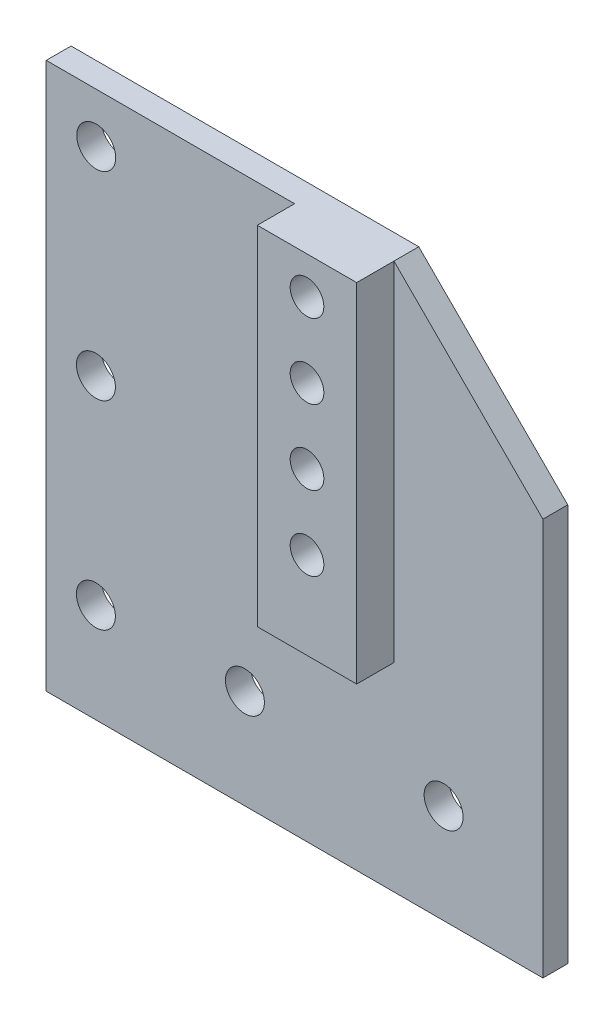
ISO-10303-21;
HEADER;
FILE_DESCRIPTION(('STEP AP214'),'2;1');
FILE_NAME('part.step','',(''),(''),'','','');
FILE_SCHEMA(('AUTOMOTIVE_DESIGN { 1 0 10303 214 1 1 1 1 }'));
ENDSEC;
DATA;
#1=APPLICATION_CONTEXT('core data for automotive mechanical design processes');
#2=APPLICATION_PROTOCOL_DEFINITION('international standard','automotive_design',2000,#1);
#3=PRODUCT_CONTEXT('',#1,'mechanical');
#4=PRODUCT('Part','Part','',(#3));
#5=PRODUCT_RELATED_PRODUCT_CATEGORY('part','',(#4));
#6=PRODUCT_DEFINITION_FORMATION('','',#4);
#7=PRODUCT_DEFINITION_CONTEXT('part definition',#1,'design');
#8=PRODUCT_DEFINITION('design','',#6,#7);
#9=PRODUCT_DEFINITION_SHAPE('','',#8);
#10=(LENGTH_UNIT() NAMED_UNIT(*) SI_UNIT(.MILLI.,.METRE.));
#11=(NAMED_UNIT(*) PLANE_ANGLE_UNIT() SI_UNIT($,.RADIAN.));
#12=(NAMED_UNIT(*) SI_UNIT($,.STERADIAN.) SOLID_ANGLE_UNIT());
#13=UNCERTAINTY_MEASURE_WITH_UNIT(LENGTH_MEASURE(1.E-05),#10,'distance_accuracy_value','');
#14=(GEOMETRIC_REPRESENTATION_CONTEXT(3) GLOBAL_UNCERTAINTY_ASSIGNED_CONTEXT((#13)) GLOBAL_UNIT_ASSIGNED_CONTEXT((#10,
#11,#12)) REPRESENTATION_CONTEXT('',''));
#15=CARTESIAN_POINT('',(0.,0.,0.));
#16=DIRECTION('',(0.,0.,1.));
#17=DIRECTION('',(1.,0.,0.));
#18=AXIS2_PLACEMENT_3D('',#15,#16,#17);
#19=CARTESIAN_POINT('',(-203.200000508,12.7,3.175));
#20=DIRECTION('',(-1.,0.,0.));
#21=DIRECTION('',(0.,0.,1.));
#22=AXIS2_PLACEMENT_3D('',#19,#20,#21);
#23=PLANE('',#22);
#24=DIRECTION('',(0.,1.,0.));
#25=VECTOR('',#24,1.);
#26=CARTESIAN_POINT('',(-203.200000508,12.7,0.));
#27=LINE('',#26,#25);
#28=CARTESIAN_POINT('',(-203.200000508,-12.7,0.));
#29=VERTEX_POINT('',#28);
#30=CARTESIAN_POINT('',(-203.200000508,38.1,0.));
#31=VERTEX_POINT('',#30);
#32=EDGE_CURVE('E160',#29,#31,#27,.T.);
#33=ORIENTED_EDGE('',*,*,#32,.T.);
#34=DIRECTION('',(0.,0.,-1.));
#35=VECTOR('',#34,1.);
#36=CARTESIAN_POINT('',(-203.200000508,38.1,3.175));
#37=LINE('',#36,#35);
#38=CARTESIAN_POINT('',(-203.200000508,38.1,3.175));
#39=VERTEX_POINT('',#38);
#40=EDGE_CURVE('E44',#39,#31,#37,.T.);
#41=ORIENTED_EDGE('',*,*,#40,.F.);
#42=DIRECTION('',(0.,1.,0.));
#43=VECTOR('',#42,1.);
#44=CARTESIAN_POINT('',(-203.200000508,-12.7,3.175));
#45=LINE('',#44,#43);
#46=CARTESIAN_POINT('',(-203.200000508,-12.7,3.175));
#47=VERTEX_POINT('',#46);
#48=EDGE_CURVE('E164',#47,#39,#45,.T.);
#49=ORIENTED_EDGE('',*,*,#48,.F.);
#50=DIRECTION('',(0.,0.,-1.));
#51=VECTOR('',#50,1.);
#52=CARTESIAN_POINT('',(-203.200000508,-12.7,3.175));
#53=LINE('',#52,#51);
#54=EDGE_CURVE('E11',#47,#29,#53,.T.);
#55=ORIENTED_EDGE('',*,*,#54,.T.);
#56=EDGE_LOOP('',(#33,#41,#49,#55));
#57=FACE_BOUND('',#56,.T.);
#58=ADVANCED_FACE('F37',(#57),#23,.F.);
#59=CARTESIAN_POINT('',(-222.250000508,57.1499999999999,3.175));
#60=DIRECTION('',(-0.707106781186548,-0.707106781186548,0.));
#61=DIRECTION('',(0.707106781186548,-0.707106781186548,0.));
#62=AXIS2_PLACEMENT_3D('',#59,#60,#61);
#63=PLANE('',#62);
#64=DIRECTION('',(-0.707106781186547,0.707106781186547,0.));
#65=VECTOR('',#64,1.);
#66=CARTESIAN_POINT('',(-222.250000508,57.1499999999999,0.));
#67=LINE('',#66,#65);
#68=CARTESIAN_POINT('',(-222.250000508,57.1499999999999,0.));
#69=VERTEX_POINT('',#68);
#70=EDGE_CURVE('E176',#31,#69,#67,.T.);
#71=ORIENTED_EDGE('',*,*,#70,.T.);
#72=DIRECTION('',(0.,0.,-1.));
#73=VECTOR('',#72,1.);
#74=CARTESIAN_POINT('',(-222.250000508,57.1499999999999,3.175));
#75=LINE('',#74,#73);
#76=CARTESIAN_POINT('',(-222.250000508,57.1499999999999,3.175));
#77=VERTEX_POINT('',#76);
#78=EDGE_CURVE('E190',#77,#69,#75,.T.);
#79=ORIENTED_EDGE('',*,*,#78,.F.);
#80=DIRECTION('',(-0.707106781186547,0.707106781186547,0.));
#81=VECTOR('',#80,1.);
#82=CARTESIAN_POINT('',(-222.250000508,57.1499999999999,3.175));
#83=LINE('',#82,#81);
#84=EDGE_CURVE('E167',#39,#77,#83,.T.);
#85=ORIENTED_EDGE('',*,*,#84,.F.);
#86=ORIENTED_EDGE('',*,*,#40,.T.);
#87=EDGE_LOOP('',(#71,#79,#85,#86));
#88=FACE_BOUND('',#87,.T.);
#89=ADVANCED_FACE('F196',(#88),#63,.F.);
#90=CARTESIAN_POINT('',(-266.700000508,57.1499999999999,3.175));
#91=DIRECTION('',(0.,-1.,0.));
#92=DIRECTION('',(0.,0.,-1.));
#93=AXIS2_PLACEMENT_3D('',#90,#91,#92);
#94=PLANE('',#93);
#95=DIRECTION('',(-1.,0.,0.));
#96=VECTOR('',#95,1.);
#97=CARTESIAN_POINT('',(-266.700000508,57.1499999999999,0.));
#98=LINE('',#97,#96);
#99=CARTESIAN_POINT('',(-266.700000508,57.1499999999999,0.));
#100=VERTEX_POINT('',#99);
#101=EDGE_CURVE('E179',#69,#100,#98,.T.);
#102=ORIENTED_EDGE('',*,*,#101,.T.);
#103=DIRECTION('',(0.,0.,-1.));
#104=VECTOR('',#103,1.);
#105=CARTESIAN_POINT('',(-266.700000508,57.1499999999999,3.175));
#106=LINE('',#105,#104);
#107=CARTESIAN_POINT('',(-266.700000508,57.1499999999999,3.175));
#108=VERTEX_POINT('',#107);
#109=EDGE_CURVE('E187',#108,#100,#106,.T.);
#110=ORIENTED_EDGE('',*,*,#109,.F.);
#111=DIRECTION('',(-1.,0.,0.));
#112=VECTOR('',#111,1.);
#113=CARTESIAN_POINT('',(-254.000000508,57.1499999999999,3.175));
#114=LINE('',#113,#112);
#115=CARTESIAN_POINT('',(-234.950000508,57.1499999999999,3.175));
#116=VERTEX_POINT('',#115);
#117=EDGE_CURVE('E169',#116,#108,#114,.T.);
#118=ORIENTED_EDGE('',*,*,#117,.F.);
#119=DIRECTION('',(0.,0.,-1.));
#120=VECTOR('',#119,1.);
#121=CARTESIAN_POINT('',(-234.950000508,57.1499999999999,7.9375));
#122=LINE('',#121,#120);
#123=CARTESIAN_POINT('',(-234.950000508,57.1499999999999,7.9375));
#124=VERTEX_POINT('',#123);
#125=EDGE_CURVE('E110',#124,#116,#122,.T.);
#126=ORIENTED_EDGE('',*,*,#125,.F.);
#127=DIRECTION('',(-1.,0.,0.));
#128=VECTOR('',#127,1.);
#129=CARTESIAN_POINT('',(-222.250000508,57.1499999999999,7.9375));
#130=LINE('',#129,#128);
#131=CARTESIAN_POINT('',(-222.250000508,57.1499999999999,7.9375));
#132=VERTEX_POINT('',#131);
#133=EDGE_CURVE('E103',#132,#124,#130,.T.);
#134=ORIENTED_EDGE('',*,*,#133,.F.);
#135=DIRECTION('',(0.,0.,-1.));
#136=VECTOR('',#135,1.);
#137=CARTESIAN_POINT('',(-222.250000508,57.1499999999999,7.9375));
#138=LINE('',#137,#136);
#139=EDGE_CURVE('E108',#132,#77,#138,.T.);
#140=ORIENTED_EDGE('',*,*,#139,.T.);
#141=ORIENTED_EDGE('',*,*,#78,.T.);
#142=EDGE_LOOP('',(#102,#110,#118,#126,#134,#140,#141));
#143=FACE_BOUND('',#142,.T.);
#144=ADVANCED_FACE('F105',(#143),#94,.F.);
#145=CARTESIAN_POINT('',(-266.700000508,-12.7,3.175));
#146=DIRECTION('',(1.,0.,0.));
#147=DIRECTION('',(0.,1.,0.));
#148=AXIS2_PLACEMENT_3D('',#145,#146,#147);
#149=PLANE('',#148);
#150=DIRECTION('',(0.,-1.,0.));
#151=VECTOR('',#150,1.);
#152=CARTESIAN_POINT('',(-266.700000508,-12.7,0.));
#153=LINE('',#152,#151);
#154=CARTESIAN_POINT('',(-266.700000508,-12.7,0.));
#155=VERTEX_POINT('',#154);
#156=EDGE_CURVE('E181',#100,#155,#153,.T.);
#157=ORIENTED_EDGE('',*,*,#156,.T.);
#158=DIRECTION('',(0.,0.,-1.));
#159=VECTOR('',#158,1.);
#160=CARTESIAN_POINT('',(-266.700000508,-12.7,3.175));
#161=LINE('',#160,#159);
#162=CARTESIAN_POINT('',(-266.700000508,-12.7,3.175));
#163=VERTEX_POINT('',#162);
#164=EDGE_CURVE('E174',#163,#155,#161,.T.);
#165=ORIENTED_EDGE('',*,*,#164,.F.);
#166=DIRECTION('',(0.,-1.,0.));
#167=VECTOR('',#166,1.);
#168=CARTESIAN_POINT('',(-266.700000508,-12.7,3.175));
#169=LINE('',#168,#167);
#170=EDGE_CURVE('E171',#108,#163,#169,.T.);
#171=ORIENTED_EDGE('',*,*,#170,.F.);
#172=ORIENTED_EDGE('',*,*,#109,.T.);
#173=EDGE_LOOP('',(#157,#165,#171,#172));
#174=FACE_BOUND('',#173,.T.);
#175=ADVANCED_FACE('F206',(#174),#149,.F.);
#176=CARTESIAN_POINT('',(-254.000000508,-12.7,3.175));
#177=DIRECTION('',(0.,1.,0.));
#178=DIRECTION('',(-1.,0.,0.));
#179=AXIS2_PLACEMENT_3D('',#176,#177,#178);
#180=PLANE('',#179);
#181=DIRECTION('',(1.,0.,0.));
#182=VECTOR('',#181,1.);
#183=CARTESIAN_POINT('',(-254.000000508,-12.7,0.));
#184=LINE('',#183,#182);
#185=EDGE_CURVE('E165',#155,#29,#184,.T.);
#186=ORIENTED_EDGE('',*,*,#185,.T.);
#187=ORIENTED_EDGE('',*,*,#54,.F.);
#188=DIRECTION('',(1.,0.,0.));
#189=VECTOR('',#188,1.);
#190=CARTESIAN_POINT('',(-254.000000508,-12.7,3.175));
#191=LINE('',#190,#189);
#192=EDGE_CURVE('E161',#163,#47,#191,.T.);
#193=ORIENTED_EDGE('',*,*,#192,.F.);
#194=ORIENTED_EDGE('',*,*,#164,.T.);
#195=EDGE_LOOP('',(#186,#187,#193,#194));
#196=FACE_BOUND('',#195,.T.);
#197=ADVANCED_FACE('F240',(#196),#180,.F.);
#198=CARTESIAN_POINT('',(0.,0.,3.175));
#199=DIRECTION('',(0.,0.,1.));
#200=DIRECTION('',(1.,0.,0.));
#201=AXIS2_PLACEMENT_3D('',#198,#199,#200);
#202=PLANE('',#201);
#203=DIRECTION('',(0.,1.,0.));
#204=VECTOR('',#203,1.);
#205=CARTESIAN_POINT('',(-222.250000508,50.7999999999999,3.175));
#206=LINE('',#205,#204);
#207=CARTESIAN_POINT('',(-222.250000508,12.6999999999999,3.175));
#208=VERTEX_POINT('',#207);
#209=EDGE_CURVE('E51',#208,#77,#206,.T.);
#210=ORIENTED_EDGE('',*,*,#209,.F.);
#211=DIRECTION('',(1.,0.,0.));
#212=VECTOR('',#211,1.);
#213=CARTESIAN_POINT('',(-222.250000508,12.6999999999999,3.175));
#214=LINE('',#213,#212);
#215=CARTESIAN_POINT('',(-234.950000508,12.6999999999999,3.175));
#216=VERTEX_POINT('',#215);
#217=EDGE_CURVE('E220',#216,#208,#214,.T.);
#218=ORIENTED_EDGE('',*,*,#217,.F.);
#219=DIRECTION('',(0.,-1.,0.));
#220=VECTOR('',#219,1.);
#221=CARTESIAN_POINT('',(-234.950000508,57.1499999999999,3.175));
#222=LINE('',#221,#220);
#223=EDGE_CURVE('E57',#116,#216,#222,.T.);
#224=ORIENTED_EDGE('',*,*,#223,.F.);
#225=ORIENTED_EDGE('',*,*,#117,.T.);
#226=ORIENTED_EDGE('',*,*,#170,.T.);
#227=ORIENTED_EDGE('',*,*,#192,.T.);
#228=ORIENTED_EDGE('',*,*,#48,.T.);
#229=ORIENTED_EDGE('',*,*,#84,.T.);
#230=EDGE_LOOP('',(#210,#218,#224,#225,#226,#227,#228,#229));
#231=FACE_BOUND('',#230,.T.);
#232=CARTESIAN_POINT('',(-260.311771093305,50.7988669391263,3.175));
#233=DIRECTION('',(0.,0.,1.));
#234=DIRECTION('',(1.,0.,0.));
#235=AXIS2_PLACEMENT_3D('',#232,#233,#234);
#236=CIRCLE('',#235,2.48919999999997);
#237=CARTESIAN_POINT('',(-257.822571093305,50.7988669391263,3.175));
#238=VERTEX_POINT('',#237);
#239=EDGE_CURVE('E125',#238,#238,#236,.T.);
#240=ORIENTED_EDGE('',*,*,#239,.F.);
#241=EDGE_LOOP('',(#240));
#242=FACE_BOUND('',#241,.T.);
#243=CARTESIAN_POINT('',(-260.350000508,25.4,3.175));
#244=DIRECTION('',(0.,0.,1.));
#245=DIRECTION('',(1.,0.,0.));
#246=AXIS2_PLACEMENT_3D('',#243,#244,#245);
#247=CIRCLE('',#246,2.48919999999997);
#248=CARTESIAN_POINT('',(-257.860800508,25.4,3.175));
#249=VERTEX_POINT('',#248);
#250=EDGE_CURVE('E136',#249,#249,#247,.T.);
#251=ORIENTED_EDGE('',*,*,#250,.F.);
#252=EDGE_LOOP('',(#251));
#253=FACE_BOUND('',#252,.T.);
#254=CARTESIAN_POINT('',(-260.350000508,0.,3.175));
#255=DIRECTION('',(0.,0.,1.));
#256=DIRECTION('',(1.,0.,0.));
#257=AXIS2_PLACEMENT_3D('',#254,#255,#256);
#258=CIRCLE('',#257,2.48919999999997);
#259=CARTESIAN_POINT('',(-257.860800508,0.,3.175));
#260=VERTEX_POINT('',#259);
#261=EDGE_CURVE('E142',#260,#260,#258,.T.);
#262=ORIENTED_EDGE('',*,*,#261,.F.);
#263=EDGE_LOOP('',(#262));
#264=FACE_BOUND('',#263,.T.);
#265=CARTESIAN_POINT('',(-241.300000508,0.,3.175));
#266=DIRECTION('',(0.,0.,1.));
#267=DIRECTION('',(1.,0.,0.));
#268=AXIS2_PLACEMENT_3D('',#265,#266,#267);
#269=CIRCLE('',#268,2.4892);
#270=CARTESIAN_POINT('',(-238.810800508,0.,3.175));
#271=VERTEX_POINT('',#270);
#272=EDGE_CURVE('E148',#271,#271,#269,.T.);
#273=ORIENTED_EDGE('',*,*,#272,.F.);
#274=EDGE_LOOP('',(#273));
#275=FACE_BOUND('',#274,.T.);
#276=CARTESIAN_POINT('',(-215.900000508,0.,3.175));
#277=DIRECTION('',(0.,0.,1.));
#278=DIRECTION('',(1.,0.,0.));
#279=AXIS2_PLACEMENT_3D('',#276,#277,#278);
#280=CIRCLE('',#279,2.4892);
#281=CARTESIAN_POINT('',(-213.410800508,0.,3.175));
#282=VERTEX_POINT('',#281);
#283=EDGE_CURVE('E154',#282,#282,#280,.T.);
#284=ORIENTED_EDGE('',*,*,#283,.F.);
#285=EDGE_LOOP('',(#284));
#286=FACE_BOUND('',#285,.T.);
#287=ADVANCED_FACE('F208',(#231,#242,#253,#264,#275,#286),#202,.T.);
#288=CARTESIAN_POINT('',(0.,0.,0.));
#289=DIRECTION('',(0.,0.,1.));
#290=DIRECTION('',(1.,0.,0.));
#291=AXIS2_PLACEMENT_3D('',#288,#289,#290);
#292=PLANE('',#291);
#293=CARTESIAN_POINT('',(-228.600000508,42.8624999999999,0.));
#294=DIRECTION('',(0.,0.,1.));
#295=DIRECTION('',(1.,0.,0.));
#296=AXIS2_PLACEMENT_3D('',#293,#294,#295);
#297=CIRCLE('',#296,2.15265000000001);
#298=CARTESIAN_POINT('',(-226.447350508,42.8624999999999,0.));
#299=VERTEX_POINT('',#298);
#300=EDGE_CURVE('E437',#299,#299,#297,.T.);
#301=ORIENTED_EDGE('',*,*,#300,.T.);
#302=EDGE_LOOP('',(#301));
#303=FACE_BOUND('',#302,.T.);
#304=CARTESIAN_POINT('',(-228.600000508,52.3874999999999,0.));
#305=DIRECTION('',(0.,0.,1.));
#306=DIRECTION('',(1.,0.,0.));
#307=AXIS2_PLACEMENT_3D('',#304,#305,#306);
#308=CIRCLE('',#307,2.15265000000001);
#309=CARTESIAN_POINT('',(-226.447350508,52.3874999999999,0.));
#310=VERTEX_POINT('',#309);
#311=EDGE_CURVE('E447',#310,#310,#308,.T.);
#312=ORIENTED_EDGE('',*,*,#311,.T.);
#313=EDGE_LOOP('',(#312));
#314=FACE_BOUND('',#313,.T.);
#315=CARTESIAN_POINT('',(-228.600000508,33.3374999999999,0.));
#316=DIRECTION('',(0.,0.,1.));
#317=DIRECTION('',(1.,0.,0.));
#318=AXIS2_PLACEMENT_3D('',#315,#316,#317);
#319=CIRCLE('',#318,2.15265000000001);
#320=CARTESIAN_POINT('',(-226.447350508,33.3374999999999,0.));
#321=VERTEX_POINT('',#320);
#322=EDGE_CURVE('E453',#321,#321,#319,.T.);
#323=ORIENTED_EDGE('',*,*,#322,.T.);
#324=EDGE_LOOP('',(#323));
#325=FACE_BOUND('',#324,.T.);
#326=CARTESIAN_POINT('',(-228.600000508,23.8125,0.));
#327=DIRECTION('',(0.,0.,1.));
#328=DIRECTION('',(1.,0.,0.));
#329=AXIS2_PLACEMENT_3D('',#326,#327,#328);
#330=CIRCLE('',#329,2.15265000000001);
#331=CARTESIAN_POINT('',(-226.447350508,23.8125,0.));
#332=VERTEX_POINT('',#331);
#333=EDGE_CURVE('E221',#332,#332,#330,.T.);
#334=ORIENTED_EDGE('',*,*,#333,.T.);
#335=EDGE_LOOP('',(#334));
#336=FACE_BOUND('',#335,.T.);
#337=CARTESIAN_POINT('',(-260.311771093305,50.7988669391263,0.));
#338=DIRECTION('',(0.,0.,1.));
#339=DIRECTION('',(1.,0.,0.));
#340=AXIS2_PLACEMENT_3D('',#337,#338,#339);
#341=CIRCLE('',#340,2.48920000000002);
#342=CARTESIAN_POINT('',(-257.822571093305,50.7988669391263,0.));
#343=VERTEX_POINT('',#342);
#344=EDGE_CURVE('E128',#343,#343,#341,.T.);
#345=ORIENTED_EDGE('',*,*,#344,.T.);
#346=EDGE_LOOP('',(#345));
#347=FACE_BOUND('',#346,.T.);
#348=CARTESIAN_POINT('',(-260.350000508,25.4,0.));
#349=DIRECTION('',(0.,0.,1.));
#350=DIRECTION('',(1.,0.,0.));
#351=AXIS2_PLACEMENT_3D('',#348,#349,#350);
#352=CIRCLE('',#351,2.48920000000002);
#353=CARTESIAN_POINT('',(-257.860800508,25.4,0.));
#354=VERTEX_POINT('',#353);
#355=EDGE_CURVE('E139',#354,#354,#352,.T.);
#356=ORIENTED_EDGE('',*,*,#355,.T.);
#357=EDGE_LOOP('',(#356));
#358=FACE_BOUND('',#357,.T.);
#359=CARTESIAN_POINT('',(-260.350000508,0.,0.));
#360=DIRECTION('',(0.,0.,1.));
#361=DIRECTION('',(1.,0.,0.));
#362=AXIS2_PLACEMENT_3D('',#359,#360,#361);
#363=CIRCLE('',#362,2.48920000000002);
#364=CARTESIAN_POINT('',(-257.860800508,0.,0.));
#365=VERTEX_POINT('',#364);
#366=EDGE_CURVE('E145',#365,#365,#363,.T.);
#367=ORIENTED_EDGE('',*,*,#366,.T.);
#368=EDGE_LOOP('',(#367));
#369=FACE_BOUND('',#368,.T.);
#370=CARTESIAN_POINT('',(-241.300000508,0.,0.));
#371=DIRECTION('',(0.,0.,1.));
#372=DIRECTION('',(1.,0.,0.));
#373=AXIS2_PLACEMENT_3D('',#370,#371,#372);
#374=CIRCLE('',#373,2.4892);
#375=CARTESIAN_POINT('',(-238.810800508,0.,0.));
#376=VERTEX_POINT('',#375);
#377=EDGE_CURVE('E151',#376,#376,#374,.T.);
#378=ORIENTED_EDGE('',*,*,#377,.T.);
#379=EDGE_LOOP('',(#378));
#380=FACE_BOUND('',#379,.T.);
#381=CARTESIAN_POINT('',(-215.900000508,0.,0.));
#382=DIRECTION('',(0.,0.,1.));
#383=DIRECTION('',(1.,0.,0.));
#384=AXIS2_PLACEMENT_3D('',#381,#382,#383);
#385=CIRCLE('',#384,2.4892);
#386=CARTESIAN_POINT('',(-213.410800508,0.,0.));
#387=VERTEX_POINT('',#386);
#388=EDGE_CURVE('E157',#387,#387,#385,.T.);
#389=ORIENTED_EDGE('',*,*,#388,.T.);
#390=EDGE_LOOP('',(#389));
#391=FACE_BOUND('',#390,.T.);
#392=ORIENTED_EDGE('',*,*,#32,.F.);
#393=ORIENTED_EDGE('',*,*,#185,.F.);
#394=ORIENTED_EDGE('',*,*,#156,.F.);
#395=ORIENTED_EDGE('',*,*,#101,.F.);
#396=ORIENTED_EDGE('',*,*,#70,.F.);
#397=EDGE_LOOP('',(#392,#393,#394,#395,#396));
#398=FACE_BOUND('',#397,.T.);
#399=ADVANCED_FACE('F200',(#303,#314,#325,#336,#347,#358,#369,#380,#391,#398),#292,.F.);
#400=CARTESIAN_POINT('',(-215.900000508,0.,3.175));
#401=DIRECTION('',(0.,0.,1.));
#402=DIRECTION('',(1.,0.,0.));
#403=AXIS2_PLACEMENT_3D('',#400,#401,#402);
#404=CYLINDRICAL_SURFACE('',#403,2.4892);
#405=ORIENTED_EDGE('',*,*,#388,.F.);
#406=EDGE_LOOP('',(#405));
#407=FACE_BOUND('',#406,.T.);
#408=ORIENTED_EDGE('',*,*,#283,.T.);
#409=EDGE_LOOP('',(#408));
#410=FACE_BOUND('',#409,.T.);
#411=ADVANCED_FACE('F276',(#407,#410),#404,.F.);
#412=CARTESIAN_POINT('',(-241.300000508,0.,3.175));
#413=DIRECTION('',(0.,0.,1.));
#414=DIRECTION('',(1.,0.,0.));
#415=AXIS2_PLACEMENT_3D('',#412,#413,#414);
#416=CYLINDRICAL_SURFACE('',#415,2.4892);
#417=ORIENTED_EDGE('',*,*,#377,.F.);
#418=EDGE_LOOP('',(#417));
#419=FACE_BOUND('',#418,.T.);
#420=ORIENTED_EDGE('',*,*,#272,.T.);
#421=EDGE_LOOP('',(#420));
#422=FACE_BOUND('',#421,.T.);
#423=ADVANCED_FACE('F281',(#419,#422),#416,.F.);
#424=CARTESIAN_POINT('',(-260.350000508,0.,3.175));
#425=DIRECTION('',(0.,0.,1.));
#426=DIRECTION('',(1.,0.,0.));
#427=AXIS2_PLACEMENT_3D('',#424,#425,#426);
#428=CYLINDRICAL_SURFACE('',#427,2.4892);
#429=ORIENTED_EDGE('',*,*,#366,.F.);
#430=EDGE_LOOP('',(#429));
#431=FACE_BOUND('',#430,.T.);
#432=ORIENTED_EDGE('',*,*,#261,.T.);
#433=EDGE_LOOP('',(#432));
#434=FACE_BOUND('',#433,.T.);
#435=ADVANCED_FACE('F294',(#431,#434),#428,.F.);
#436=CARTESIAN_POINT('',(-260.350000508,25.4,3.175));
#437=DIRECTION('',(0.,0.,1.));
#438=DIRECTION('',(1.,0.,0.));
#439=AXIS2_PLACEMENT_3D('',#436,#437,#438);
#440=CYLINDRICAL_SURFACE('',#439,2.4892);
#441=ORIENTED_EDGE('',*,*,#355,.F.);
#442=EDGE_LOOP('',(#441));
#443=FACE_BOUND('',#442,.T.);
#444=ORIENTED_EDGE('',*,*,#250,.T.);
#445=EDGE_LOOP('',(#444));
#446=FACE_BOUND('',#445,.T.);
#447=ADVANCED_FACE('F305',(#443,#446),#440,.F.);
#448=CARTESIAN_POINT('',(-260.311771093305,50.7988669391263,3.175));
#449=DIRECTION('',(0.,0.,1.));
#450=DIRECTION('',(1.,0.,0.));
#451=AXIS2_PLACEMENT_3D('',#448,#449,#450);
#452=CYLINDRICAL_SURFACE('',#451,2.4892);
#453=ORIENTED_EDGE('',*,*,#344,.F.);
#454=EDGE_LOOP('',(#453));
#455=FACE_BOUND('',#454,.T.);
#456=ORIENTED_EDGE('',*,*,#239,.T.);
#457=EDGE_LOOP('',(#456));
#458=FACE_BOUND('',#457,.T.);
#459=ADVANCED_FACE('F233',(#455,#458),#452,.F.);
#460=CARTESIAN_POINT('',(-234.950000508,57.1499999999999,7.9375));
#461=DIRECTION('',(1.,0.,0.));
#462=DIRECTION('',(0.,0.,-1.));
#463=AXIS2_PLACEMENT_3D('',#460,#461,#462);
#464=PLANE('',#463);
#465=ORIENTED_EDGE('',*,*,#223,.T.);
#466=DIRECTION('',(0.,0.,-1.));
#467=VECTOR('',#466,1.);
#468=CARTESIAN_POINT('',(-234.950000508,12.6999999999999,7.9375));
#469=LINE('',#468,#467);
#470=CARTESIAN_POINT('',(-234.950000508,12.6999999999999,7.9375));
#471=VERTEX_POINT('',#470);
#472=EDGE_CURVE('E130',#471,#216,#469,.T.);
#473=ORIENTED_EDGE('',*,*,#472,.F.);
#474=DIRECTION('',(0.,-1.,0.));
#475=VECTOR('',#474,1.);
#476=CARTESIAN_POINT('',(-234.950000508,57.1499999999999,7.9375));
#477=LINE('',#476,#475);
#478=EDGE_CURVE('E113',#124,#471,#477,.T.);
#479=ORIENTED_EDGE('',*,*,#478,.F.);
#480=ORIENTED_EDGE('',*,*,#125,.T.);
#481=EDGE_LOOP('',(#465,#473,#479,#480));
#482=FACE_BOUND('',#481,.T.);
#483=ADVANCED_FACE('F212',(#482),#464,.F.);
#484=CARTESIAN_POINT('',(-222.250000508,12.6999999999999,7.9375));
#485=DIRECTION('',(0.,1.,0.));
#486=DIRECTION('',(-1.,0.,0.));
#487=AXIS2_PLACEMENT_3D('',#484,#485,#486);
#488=PLANE('',#487);
#489=ORIENTED_EDGE('',*,*,#217,.T.);
#490=DIRECTION('',(0.,0.,-1.));
#491=VECTOR('',#490,1.);
#492=CARTESIAN_POINT('',(-222.250000508,12.6999999999999,7.9375));
#493=LINE('',#492,#491);
#494=CARTESIAN_POINT('',(-222.250000508,12.6999999999999,7.9375));
#495=VERTEX_POINT('',#494);
#496=EDGE_CURVE('E216',#495,#208,#493,.T.);
#497=ORIENTED_EDGE('',*,*,#496,.F.);
#498=DIRECTION('',(1.,0.,0.));
#499=VECTOR('',#498,1.);
#500=CARTESIAN_POINT('',(-222.250000508,12.6999999999999,7.9375));
#501=LINE('',#500,#499);
#502=EDGE_CURVE('E119',#471,#495,#501,.T.);
#503=ORIENTED_EDGE('',*,*,#502,.F.);
#504=ORIENTED_EDGE('',*,*,#472,.T.);
#505=EDGE_LOOP('',(#489,#497,#503,#504));
#506=FACE_BOUND('',#505,.T.);
#507=ADVANCED_FACE('F225',(#506),#488,.F.);
#508=CARTESIAN_POINT('',(-222.250000508,50.7999999999999,7.9375));
#509=DIRECTION('',(-1.,0.,0.));
#510=DIRECTION('',(0.,0.,1.));
#511=AXIS2_PLACEMENT_3D('',#508,#509,#510);
#512=PLANE('',#511);
#513=ORIENTED_EDGE('',*,*,#209,.T.);
#514=ORIENTED_EDGE('',*,*,#139,.F.);
#515=DIRECTION('',(0.,1.,0.));
#516=VECTOR('',#515,1.);
#517=CARTESIAN_POINT('',(-222.250000508,50.7999999999999,7.9375));
#518=LINE('',#517,#516);
#519=EDGE_CURVE('E114',#495,#132,#518,.T.);
#520=ORIENTED_EDGE('',*,*,#519,.F.);
#521=ORIENTED_EDGE('',*,*,#496,.T.);
#522=EDGE_LOOP('',(#513,#514,#520,#521));
#523=FACE_BOUND('',#522,.T.);
#524=ADVANCED_FACE('F124',(#523),#512,.F.);
#525=CARTESIAN_POINT('',(0.,0.,7.9375));
#526=DIRECTION('',(0.,0.,1.));
#527=DIRECTION('',(1.,0.,0.));
#528=AXIS2_PLACEMENT_3D('',#525,#526,#527);
#529=PLANE('',#528);
#530=CARTESIAN_POINT('',(-228.600000508,42.8624999999999,7.9375));
#531=DIRECTION('',(0.,0.,1.));
#532=DIRECTION('',(1.,0.,0.));
#533=AXIS2_PLACEMENT_3D('',#530,#531,#532);
#534=CIRCLE('',#533,2.15265000000001);
#535=CARTESIAN_POINT('',(-226.447350508,42.8624999999999,7.9375));
#536=VERTEX_POINT('',#535);
#537=EDGE_CURVE('E440',#536,#536,#534,.T.);
#538=ORIENTED_EDGE('',*,*,#537,.F.);
#539=EDGE_LOOP('',(#538));
#540=FACE_BOUND('',#539,.T.);
#541=CARTESIAN_POINT('',(-228.600000508,52.3874999999999,7.9375));
#542=DIRECTION('',(0.,0.,1.));
#543=DIRECTION('',(1.,0.,0.));
#544=AXIS2_PLACEMENT_3D('',#541,#542,#543);
#545=CIRCLE('',#544,2.15265000000001);
#546=CARTESIAN_POINT('',(-226.447350508,52.3874999999999,7.9375));
#547=VERTEX_POINT('',#546);
#548=EDGE_CURVE('E442',#547,#547,#545,.T.);
#549=ORIENTED_EDGE('',*,*,#548,.F.);
#550=EDGE_LOOP('',(#549));
#551=FACE_BOUND('',#550,.T.);
#552=CARTESIAN_POINT('',(-228.600000508,33.3374999999999,7.9375));
#553=DIRECTION('',(0.,0.,1.));
#554=DIRECTION('',(1.,0.,0.));
#555=AXIS2_PLACEMENT_3D('',#552,#553,#554);
#556=CIRCLE('',#555,2.15265000000001);
#557=CARTESIAN_POINT('',(-226.447350508,33.3374999999999,7.9375));
#558=VERTEX_POINT('',#557);
#559=EDGE_CURVE('E450',#558,#558,#556,.T.);
#560=ORIENTED_EDGE('',*,*,#559,.F.);
#561=EDGE_LOOP('',(#560));
#562=FACE_BOUND('',#561,.T.);
#563=CARTESIAN_POINT('',(-228.600000508,23.8125,7.9375));
#564=DIRECTION('',(0.,0.,1.));
#565=DIRECTION('',(1.,0.,0.));
#566=AXIS2_PLACEMENT_3D('',#563,#564,#565);
#567=CIRCLE('',#566,2.15265000000001);
#568=CARTESIAN_POINT('',(-226.447350508,23.8125,7.9375));
#569=VERTEX_POINT('',#568);
#570=EDGE_CURVE('E456',#569,#569,#567,.T.);
#571=ORIENTED_EDGE('',*,*,#570,.F.);
#572=EDGE_LOOP('',(#571));
#573=FACE_BOUND('',#572,.T.);
#574=ORIENTED_EDGE('',*,*,#519,.T.);
#575=ORIENTED_EDGE('',*,*,#133,.T.);
#576=ORIENTED_EDGE('',*,*,#478,.T.);
#577=ORIENTED_EDGE('',*,*,#502,.T.);
#578=EDGE_LOOP('',(#574,#575,#576,#577));
#579=FACE_BOUND('',#578,.T.);
#580=ADVANCED_FACE('F117',(#540,#551,#562,#573,#579),#529,.T.);
#581=CARTESIAN_POINT('',(-228.600000508,23.8125,7.9375));
#582=DIRECTION('',(0.,0.,1.));
#583=DIRECTION('',(1.,0.,0.));
#584=AXIS2_PLACEMENT_3D('',#581,#582,#583);
#585=CYLINDRICAL_SURFACE('',#584,2.15265000000001);
#586=ORIENTED_EDGE('',*,*,#333,.F.);
#587=EDGE_LOOP('',(#586));
#588=FACE_BOUND('',#587,.T.);
#589=ORIENTED_EDGE('',*,*,#570,.T.);
#590=EDGE_LOOP('',(#589));
#591=FACE_BOUND('',#590,.T.);
#592=ADVANCED_FACE('F381',(#588,#591),#585,.F.);
#593=CARTESIAN_POINT('',(-228.600000508,33.3374999999999,7.9375));
#594=DIRECTION('',(0.,0.,1.));
#595=DIRECTION('',(1.,0.,0.));
#596=AXIS2_PLACEMENT_3D('',#593,#594,#595);
#597=CYLINDRICAL_SURFACE('',#596,2.15265000000001);
#598=ORIENTED_EDGE('',*,*,#322,.F.);
#599=EDGE_LOOP('',(#598));
#600=FACE_BOUND('',#599,.T.);
#601=ORIENTED_EDGE('',*,*,#559,.T.);
#602=EDGE_LOOP('',(#601));
#603=FACE_BOUND('',#602,.T.);
#604=ADVANCED_FACE('F392',(#600,#603),#597,.F.);
#605=CARTESIAN_POINT('',(-228.600000508,52.3874999999999,7.9375));
#606=DIRECTION('',(0.,0.,1.));
#607=DIRECTION('',(1.,0.,0.));
#608=AXIS2_PLACEMENT_3D('',#605,#606,#607);
#609=CYLINDRICAL_SURFACE('',#608,2.15265000000001);
#610=ORIENTED_EDGE('',*,*,#311,.F.);
#611=EDGE_LOOP('',(#610));
#612=FACE_BOUND('',#611,.T.);
#613=ORIENTED_EDGE('',*,*,#548,.T.);
#614=EDGE_LOOP('',(#613));
#615=FACE_BOUND('',#614,.T.);
#616=ADVANCED_FACE('F403',(#612,#615),#609,.F.);
#617=CARTESIAN_POINT('',(-228.600000508,42.8624999999999,7.9375));
#618=DIRECTION('',(0.,0.,1.));
#619=DIRECTION('',(1.,0.,0.));
#620=AXIS2_PLACEMENT_3D('',#617,#618,#619);
#621=CYLINDRICAL_SURFACE('',#620,2.15265000000001);
#622=ORIENTED_EDGE('',*,*,#300,.F.);
#623=EDGE_LOOP('',(#622));
#624=FACE_BOUND('',#623,.T.);
#625=ORIENTED_EDGE('',*,*,#537,.T.);
#626=EDGE_LOOP('',(#625));
#627=FACE_BOUND('',#626,.T.);
#628=ADVANCED_FACE('F414',(#624,#627),#621,.F.);
#629=CLOSED_SHELL('',(#58,#89,#144,#175,#197,#287,#399,#411,#423,#435,#447,#459,#483,#507,#524,
#580,#592,#604,#616,#628));
#630=MANIFOLD_SOLID_BREP('B2',#629);
#631=ADVANCED_BREP_SHAPE_REPRESENTATION('',(#18,#630),#14);
#632=SHAPE_DEFINITION_REPRESENTATION(#9,#631);
ENDSEC;
END-ISO-10303-21;
